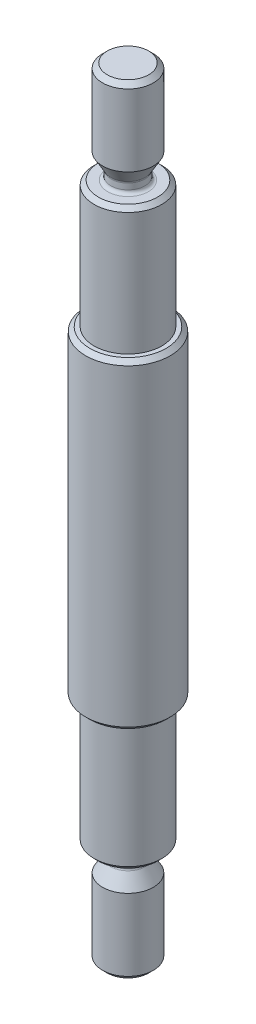
ISO-10303-21;
HEADER;
FILE_DESCRIPTION(('STEP AP214'),'2;1');
FILE_NAME('part.step','',(''),(''),'','','');
FILE_SCHEMA(('AUTOMOTIVE_DESIGN { 1 0 10303 214 1 1 1 1 }'));
ENDSEC;
DATA;
#1=APPLICATION_CONTEXT('core data for automotive mechanical design processes');
#2=APPLICATION_PROTOCOL_DEFINITION('international standard','automotive_design',2000,#1);
#3=PRODUCT_CONTEXT('',#1,'mechanical');
#4=PRODUCT('Part','Part','',(#3));
#5=PRODUCT_RELATED_PRODUCT_CATEGORY('part','',(#4));
#6=PRODUCT_DEFINITION_FORMATION('','',#4);
#7=PRODUCT_DEFINITION_CONTEXT('part definition',#1,'design');
#8=PRODUCT_DEFINITION('design','',#6,#7);
#9=PRODUCT_DEFINITION_SHAPE('','',#8);
#10=(LENGTH_UNIT() NAMED_UNIT(*) SI_UNIT(.MILLI.,.METRE.));
#11=(NAMED_UNIT(*) PLANE_ANGLE_UNIT() SI_UNIT($,.RADIAN.));
#12=(NAMED_UNIT(*) SI_UNIT($,.STERADIAN.) SOLID_ANGLE_UNIT());
#13=UNCERTAINTY_MEASURE_WITH_UNIT(LENGTH_MEASURE(1.E-05),#10,'distance_accuracy_value','');
#14=(GEOMETRIC_REPRESENTATION_CONTEXT(3) GLOBAL_UNCERTAINTY_ASSIGNED_CONTEXT((#13)) GLOBAL_UNIT_ASSIGNED_CONTEXT((#10,
#11,#12)) REPRESENTATION_CONTEXT('',''));
#15=CARTESIAN_POINT('',(0.,0.,0.));
#16=DIRECTION('',(0.,0.,1.));
#17=DIRECTION('',(1.,0.,0.));
#18=AXIS2_PLACEMENT_3D('',#15,#16,#17);
#19=CARTESIAN_POINT('',(0.,19.,0.));
#20=DIRECTION('',(0.,-1.,0.));
#21=DIRECTION('',(0.,0.,-1.));
#22=AXIS2_PLACEMENT_3D('',#19,#20,#21);
#23=CYLINDRICAL_SURFACE('',#22,5.);
#24=CARTESIAN_POINT('',(0.,18.5,0.));
#25=DIRECTION('',(0.,1.,0.));
#26=DIRECTION('',(0.,0.,1.));
#27=AXIS2_PLACEMENT_3D('',#24,#25,#26);
#28=CIRCLE('',#27,5.);
#29=CARTESIAN_POINT('',(0.,18.5,5.));
#30=VERTEX_POINT('',#29);
#31=EDGE_CURVE('E106',#30,#30,#28,.F.);
#32=ORIENTED_EDGE('',*,*,#31,.T.);
#33=EDGE_LOOP('',(#32));
#34=FACE_BOUND('',#33,.T.);
#35=CARTESIAN_POINT('',(0.,-18.5,0.));
#36=DIRECTION('',(0.,1.,0.));
#37=DIRECTION('',(0.,0.,1.));
#38=AXIS2_PLACEMENT_3D('',#35,#36,#37);
#39=CIRCLE('',#38,5.);
#40=CARTESIAN_POINT('',(0.,-18.5,5.));
#41=VERTEX_POINT('',#40);
#42=EDGE_CURVE('E110',#41,#41,#39,.T.);
#43=ORIENTED_EDGE('',*,*,#42,.T.);
#44=EDGE_LOOP('',(#43));
#45=FACE_BOUND('',#44,.T.);
#46=ADVANCED_FACE('F71',(#34,#45),#23,.T.);
#47=CARTESIAN_POINT('',(0.,19.,0.));
#48=DIRECTION('',(0.,1.,0.));
#49=DIRECTION('',(0.,0.,1.));
#50=AXIS2_PLACEMENT_3D('',#47,#48,#49);
#51=PLANE('',#50);
#52=CARTESIAN_POINT('',(0.,19.,0.));
#53=DIRECTION('',(0.,1.,0.));
#54=DIRECTION('',(0.,0.,1.));
#55=AXIS2_PLACEMENT_3D('',#52,#53,#54);
#56=CIRCLE('',#55,4.5);
#57=CARTESIAN_POINT('',(0.,19.,4.5));
#58=VERTEX_POINT('',#57);
#59=EDGE_CURVE('E114',#58,#58,#56,.T.);
#60=ORIENTED_EDGE('',*,*,#59,.T.);
#61=EDGE_LOOP('',(#60));
#62=FACE_BOUND('',#61,.T.);
#63=CARTESIAN_POINT('',(0.,19.,0.));
#64=DIRECTION('',(0.,1.,0.));
#65=DIRECTION('',(0.,0.,1.));
#66=AXIS2_PLACEMENT_3D('',#63,#64,#65);
#67=CIRCLE('',#66,4.);
#68=CARTESIAN_POINT('',(0.,19.,4.));
#69=VERTEX_POINT('',#68);
#70=EDGE_CURVE('E118',#69,#69,#67,.T.);
#71=ORIENTED_EDGE('',*,*,#70,.F.);
#72=EDGE_LOOP('',(#71));
#73=FACE_BOUND('',#72,.T.);
#74=ADVANCED_FACE('F203',(#62,#73),#51,.T.);
#75=CARTESIAN_POINT('',(0.,-19.,0.));
#76=DIRECTION('',(0.,1.,0.));
#77=DIRECTION('',(0.,0.,1.));
#78=AXIS2_PLACEMENT_3D('',#75,#76,#77);
#79=PLANE('',#78);
#80=CARTESIAN_POINT('',(0.,-19.,0.));
#81=DIRECTION('',(0.,1.,0.));
#82=DIRECTION('',(0.,0.,1.));
#83=AXIS2_PLACEMENT_3D('',#80,#81,#82);
#84=CIRCLE('',#83,4.49999999999998);
#85=CARTESIAN_POINT('',(0.,-19.,4.49999999999998));
#86=VERTEX_POINT('',#85);
#87=EDGE_CURVE('E102',#86,#86,#84,.F.);
#88=ORIENTED_EDGE('',*,*,#87,.T.);
#89=EDGE_LOOP('',(#88));
#90=FACE_BOUND('',#89,.T.);
#91=CARTESIAN_POINT('',(0.,-19.,0.));
#92=DIRECTION('',(0.,1.,0.));
#93=DIRECTION('',(0.,0.,1.));
#94=AXIS2_PLACEMENT_3D('',#91,#92,#93);
#95=CIRCLE('',#94,4.);
#96=CARTESIAN_POINT('',(0.,-19.,4.));
#97=VERTEX_POINT('',#96);
#98=EDGE_CURVE('E121',#97,#97,#95,.T.);
#99=ORIENTED_EDGE('',*,*,#98,.T.);
#100=EDGE_LOOP('',(#99));
#101=FACE_BOUND('',#100,.T.);
#102=ADVANCED_FACE('F209',(#90,#101),#79,.F.);
#103=CARTESIAN_POINT('',(0.,34.,0.));
#104=DIRECTION('',(0.,-1.,0.));
#105=DIRECTION('',(0.,0.,-1.));
#106=AXIS2_PLACEMENT_3D('',#103,#104,#105);
#107=CYLINDRICAL_SURFACE('',#106,4.);
#108=CARTESIAN_POINT('',(0.,33.5,0.));
#109=DIRECTION('',(0.,1.,0.));
#110=DIRECTION('',(0.,0.,1.));
#111=AXIS2_PLACEMENT_3D('',#108,#109,#110);
#112=CIRCLE('',#111,4.);
#113=CARTESIAN_POINT('',(0.,33.5,4.));
#114=VERTEX_POINT('',#113);
#115=EDGE_CURVE('E88',#114,#114,#112,.F.);
#116=ORIENTED_EDGE('',*,*,#115,.T.);
#117=EDGE_LOOP('',(#116));
#118=FACE_BOUND('',#117,.T.);
#119=ORIENTED_EDGE('',*,*,#70,.T.);
#120=EDGE_LOOP('',(#119));
#121=FACE_BOUND('',#120,.T.);
#122=ADVANCED_FACE('F247',(#118,#121),#107,.T.);
#123=CARTESIAN_POINT('',(0.,34.,0.));
#124=DIRECTION('',(0.,1.,0.));
#125=DIRECTION('',(0.,0.,1.));
#126=AXIS2_PLACEMENT_3D('',#123,#124,#125);
#127=PLANE('',#126);
#128=CARTESIAN_POINT('',(0.,34.,0.));
#129=DIRECTION('',(0.,1.,0.));
#130=DIRECTION('',(0.,0.,1.));
#131=AXIS2_PLACEMENT_3D('',#128,#129,#130);
#132=CIRCLE('',#131,3.49999999999999);
#133=CARTESIAN_POINT('',(0.,34.,3.49999999999999));
#134=VERTEX_POINT('',#133);
#135=EDGE_CURVE('E96',#134,#134,#132,.T.);
#136=ORIENTED_EDGE('',*,*,#135,.T.);
#137=EDGE_LOOP('',(#136));
#138=FACE_BOUND('',#137,.T.);
#139=CARTESIAN_POINT('',(0.,34.,0.));
#140=DIRECTION('',(0.,-1.,0.));
#141=DIRECTION('',(0.,0.,-1.));
#142=AXIS2_PLACEMENT_3D('',#139,#140,#141);
#143=CIRCLE('',#142,2.4);
#144=CARTESIAN_POINT('',(0.,34.,-2.4));
#145=VERTEX_POINT('',#144);
#146=EDGE_CURVE('E140',#145,#145,#143,.T.);
#147=ORIENTED_EDGE('',*,*,#146,.T.);
#148=EDGE_LOOP('',(#147));
#149=FACE_BOUND('',#148,.T.);
#150=ADVANCED_FACE('F252',(#138,#149),#127,.T.);
#151=CARTESIAN_POINT('',(0.,-34.,0.));
#152=DIRECTION('',(0.,1.,0.));
#153=DIRECTION('',(0.,0.,1.));
#154=AXIS2_PLACEMENT_3D('',#151,#152,#153);
#155=CYLINDRICAL_SURFACE('',#154,4.);
#156=CARTESIAN_POINT('',(0.,-33.5,0.));
#157=DIRECTION('',(0.,1.,0.));
#158=DIRECTION('',(0.,0.,1.));
#159=AXIS2_PLACEMENT_3D('',#156,#157,#158);
#160=CIRCLE('',#159,4.);
#161=CARTESIAN_POINT('',(0.,-33.5,4.));
#162=VERTEX_POINT('',#161);
#163=EDGE_CURVE('E80',#162,#162,#160,.T.);
#164=ORIENTED_EDGE('',*,*,#163,.T.);
#165=EDGE_LOOP('',(#164));
#166=FACE_BOUND('',#165,.T.);
#167=ORIENTED_EDGE('',*,*,#98,.F.);
#168=EDGE_LOOP('',(#167));
#169=FACE_BOUND('',#168,.T.);
#170=ADVANCED_FACE('F250',(#166,#169),#155,.T.);
#171=CARTESIAN_POINT('',(0.,-34.,0.));
#172=DIRECTION('',(0.,1.,0.));
#173=DIRECTION('',(0.,0.,1.));
#174=AXIS2_PLACEMENT_3D('',#171,#172,#173);
#175=PLANE('',#174);
#176=CARTESIAN_POINT('',(0.,-34.,0.));
#177=DIRECTION('',(0.,1.,0.));
#178=DIRECTION('',(0.,0.,1.));
#179=AXIS2_PLACEMENT_3D('',#176,#177,#178);
#180=CIRCLE('',#179,3.5);
#181=CARTESIAN_POINT('',(0.,-34.,3.5));
#182=VERTEX_POINT('',#181);
#183=EDGE_CURVE('E11',#182,#182,#180,.F.);
#184=ORIENTED_EDGE('',*,*,#183,.T.);
#185=EDGE_LOOP('',(#184));
#186=FACE_BOUND('',#185,.T.);
#187=CARTESIAN_POINT('',(0.,-34.,0.));
#188=DIRECTION('',(0.,1.,0.));
#189=DIRECTION('',(0.,0.,1.));
#190=AXIS2_PLACEMENT_3D('',#187,#188,#189);
#191=CIRCLE('',#190,2.4);
#192=CARTESIAN_POINT('',(0.,-34.,2.4));
#193=VERTEX_POINT('',#192);
#194=EDGE_CURVE('E168',#193,#193,#191,.T.);
#195=ORIENTED_EDGE('',*,*,#194,.T.);
#196=EDGE_LOOP('',(#195));
#197=FACE_BOUND('',#196,.T.);
#198=ADVANCED_FACE('F223',(#186,#197),#175,.F.);
#199=CARTESIAN_POINT('',(0.,19.,0.));
#200=DIRECTION('',(0.,-1.,0.));
#201=DIRECTION('',(0.,0.,-1.));
#202=AXIS2_PLACEMENT_3D('',#199,#200,#201);
#203=CONICAL_SURFACE('',#202,4.5,0.785398163397444);
#204=ORIENTED_EDGE('',*,*,#31,.F.);
#205=EDGE_LOOP('',(#204));
#206=FACE_BOUND('',#205,.T.);
#207=ORIENTED_EDGE('',*,*,#59,.F.);
#208=EDGE_LOOP('',(#207));
#209=FACE_BOUND('',#208,.T.);
#210=ADVANCED_FACE('F216',(#206,#209),#203,.T.);
#211=CARTESIAN_POINT('',(0.,-18.5,0.));
#212=DIRECTION('',(0.,1.,0.));
#213=DIRECTION('',(0.,0.,1.));
#214=AXIS2_PLACEMENT_3D('',#211,#212,#213);
#215=CONICAL_SURFACE('',#214,5.,0.785398163397458);
#216=ORIENTED_EDGE('',*,*,#87,.F.);
#217=EDGE_LOOP('',(#216));
#218=FACE_BOUND('',#217,.T.);
#219=ORIENTED_EDGE('',*,*,#42,.F.);
#220=EDGE_LOOP('',(#219));
#221=FACE_BOUND('',#220,.T.);
#222=ADVANCED_FACE('F222',(#218,#221),#215,.T.);
#223=CARTESIAN_POINT('',(0.,46.,0.));
#224=DIRECTION('',(0.,-1.,0.));
#225=DIRECTION('',(0.,0.,-1.));
#226=AXIS2_PLACEMENT_3D('',#223,#224,#225);
#227=CYLINDRICAL_SURFACE('',#226,3.);
#228=CARTESIAN_POINT('',(0.,36.9392304845413,0.));
#229=DIRECTION('',(0.,-1.,0.));
#230=DIRECTION('',(0.,0.,-1.));
#231=AXIS2_PLACEMENT_3D('',#228,#229,#230);
#232=CIRCLE('',#231,3.);
#233=CARTESIAN_POINT('',(0.,36.9392304845413,-3.));
#234=VERTEX_POINT('',#233);
#235=EDGE_CURVE('E124',#234,#234,#232,.T.);
#236=ORIENTED_EDGE('',*,*,#235,.F.);
#237=EDGE_LOOP('',(#236));
#238=FACE_BOUND('',#237,.T.);
#239=CARTESIAN_POINT('',(0.,45.4455,0.));
#240=DIRECTION('',(0.,-1.,0.));
#241=DIRECTION('',(0.,0.,-1.));
#242=AXIS2_PLACEMENT_3D('',#239,#240,#241);
#243=CIRCLE('',#242,3.);
#244=CARTESIAN_POINT('',(0.,45.4455,-3.));
#245=VERTEX_POINT('',#244);
#246=EDGE_CURVE('E148',#245,#245,#243,.T.);
#247=ORIENTED_EDGE('',*,*,#246,.T.);
#248=EDGE_LOOP('',(#247));
#249=FACE_BOUND('',#248,.T.);
#250=ADVANCED_FACE('F229',(#238,#249),#227,.T.);
#251=CARTESIAN_POINT('',(0.,36.9392304845413,0.));
#252=DIRECTION('',(0.,1.,0.));
#253=DIRECTION('',(0.,0.,1.));
#254=AXIS2_PLACEMENT_3D('',#251,#252,#253);
#255=CONICAL_SURFACE('',#254,3.,0.523598775598297);
#256=CARTESIAN_POINT('',(0.,35.3,0.));
#257=DIRECTION('',(0.,-1.,0.));
#258=DIRECTION('',(0.,0.,-1.));
#259=AXIS2_PLACEMENT_3D('',#256,#257,#258);
#260=CIRCLE('',#259,2.05358983848622);
#261=CARTESIAN_POINT('',(0.,35.3,-2.05358983848622));
#262=VERTEX_POINT('',#261);
#263=EDGE_CURVE('E128',#262,#262,#260,.T.);
#264=ORIENTED_EDGE('',*,*,#263,.F.);
#265=EDGE_LOOP('',(#264));
#266=FACE_BOUND('',#265,.T.);
#267=ORIENTED_EDGE('',*,*,#235,.T.);
#268=EDGE_LOOP('',(#267));
#269=FACE_BOUND('',#268,.T.);
#270=ADVANCED_FACE('F238',(#266,#269),#255,.T.);
#271=CARTESIAN_POINT('',(0.,35.1,0.));
#272=DIRECTION('',(0.,-1.,0.));
#273=DIRECTION('',(0.,0.,-1.));
#274=AXIS2_PLACEMENT_3D('',#271,#272,#273);
#275=TOROIDAL_SURFACE('',#274,2.4,0.400000000000001);
#276=CARTESIAN_POINT('',(0.,35.1,0.));
#277=DIRECTION('',(0.,-1.,0.));
#278=DIRECTION('',(0.,0.,-1.));
#279=AXIS2_PLACEMENT_3D('',#276,#277,#278);
#280=CIRCLE('',#279,2.);
#281=CARTESIAN_POINT('',(0.,35.1,-2.));
#282=VERTEX_POINT('',#281);
#283=EDGE_CURVE('E132',#282,#282,#280,.T.);
#284=ORIENTED_EDGE('',*,*,#283,.F.);
#285=EDGE_LOOP('',(#284));
#286=FACE_BOUND('',#285,.T.);
#287=ORIENTED_EDGE('',*,*,#263,.T.);
#288=EDGE_LOOP('',(#287));
#289=FACE_BOUND('',#288,.T.);
#290=ADVANCED_FACE('F286',(#286,#289),#275,.F.);
#291=CARTESIAN_POINT('',(0.,46.,0.));
#292=DIRECTION('',(0.,-1.,0.));
#293=DIRECTION('',(0.,0.,-1.));
#294=AXIS2_PLACEMENT_3D('',#291,#292,#293);
#295=CYLINDRICAL_SURFACE('',#294,2.);
#296=CARTESIAN_POINT('',(0.,34.4,0.));
#297=DIRECTION('',(0.,-1.,0.));
#298=DIRECTION('',(0.,0.,-1.));
#299=AXIS2_PLACEMENT_3D('',#296,#297,#298);
#300=CIRCLE('',#299,2.);
#301=CARTESIAN_POINT('',(0.,34.4,-2.));
#302=VERTEX_POINT('',#301);
#303=EDGE_CURVE('E136',#302,#302,#300,.T.);
#304=ORIENTED_EDGE('',*,*,#303,.F.);
#305=EDGE_LOOP('',(#304));
#306=FACE_BOUND('',#305,.T.);
#307=ORIENTED_EDGE('',*,*,#283,.T.);
#308=EDGE_LOOP('',(#307));
#309=FACE_BOUND('',#308,.T.);
#310=ADVANCED_FACE('F280',(#306,#309),#295,.T.);
#311=CARTESIAN_POINT('',(0.,34.4,0.));
#312=DIRECTION('',(0.,-1.,0.));
#313=DIRECTION('',(0.,0.,-1.));
#314=AXIS2_PLACEMENT_3D('',#311,#312,#313);
#315=TOROIDAL_SURFACE('',#314,2.4,0.4);
#316=ORIENTED_EDGE('',*,*,#146,.F.);
#317=EDGE_LOOP('',(#316));
#318=FACE_BOUND('',#317,.T.);
#319=ORIENTED_EDGE('',*,*,#303,.T.);
#320=EDGE_LOOP('',(#319));
#321=FACE_BOUND('',#320,.T.);
#322=ADVANCED_FACE('F276',(#318,#321),#315,.F.);
#323=CARTESIAN_POINT('',(0.,46.,0.));
#324=DIRECTION('',(0.,-1.,0.));
#325=DIRECTION('',(0.,0.,-1.));
#326=AXIS2_PLACEMENT_3D('',#323,#324,#325);
#327=CONICAL_SURFACE('',#326,2.4455,0.785398163397449);
#328=ORIENTED_EDGE('',*,*,#246,.F.);
#329=EDGE_LOOP('',(#328));
#330=FACE_BOUND('',#329,.T.);
#331=CARTESIAN_POINT('',(0.,46.,0.));
#332=DIRECTION('',(0.,-1.,0.));
#333=DIRECTION('',(0.,0.,-1.));
#334=AXIS2_PLACEMENT_3D('',#331,#332,#333);
#335=CIRCLE('',#334,2.4455);
#336=CARTESIAN_POINT('',(0.,46.,-2.4455));
#337=VERTEX_POINT('',#336);
#338=EDGE_CURVE('E144',#337,#337,#335,.T.);
#339=ORIENTED_EDGE('',*,*,#338,.T.);
#340=EDGE_LOOP('',(#339));
#341=FACE_BOUND('',#340,.T.);
#342=ADVANCED_FACE('F279',(#330,#341),#327,.T.);
#343=CARTESIAN_POINT('',(0.,46.,0.));
#344=DIRECTION('',(0.,1.,0.));
#345=DIRECTION('',(0.,0.,1.));
#346=AXIS2_PLACEMENT_3D('',#343,#344,#345);
#347=PLANE('',#346);
#348=ORIENTED_EDGE('',*,*,#338,.F.);
#349=EDGE_LOOP('',(#348));
#350=FACE_BOUND('',#349,.T.);
#351=ADVANCED_FACE('F304',(#350),#347,.T.);
#352=CARTESIAN_POINT('',(0.,-46.,0.));
#353=DIRECTION('',(0.,1.,0.));
#354=DIRECTION('',(0.,0.,1.));
#355=AXIS2_PLACEMENT_3D('',#352,#353,#354);
#356=CYLINDRICAL_SURFACE('',#355,3.);
#357=CARTESIAN_POINT('',(0.,-36.9392304845413,0.));
#358=DIRECTION('',(0.,1.,0.));
#359=DIRECTION('',(0.,0.,1.));
#360=AXIS2_PLACEMENT_3D('',#357,#358,#359);
#361=CIRCLE('',#360,3.);
#362=CARTESIAN_POINT('',(0.,-36.9392304845413,3.));
#363=VERTEX_POINT('',#362);
#364=EDGE_CURVE('E152',#363,#363,#361,.T.);
#365=ORIENTED_EDGE('',*,*,#364,.F.);
#366=EDGE_LOOP('',(#365));
#367=FACE_BOUND('',#366,.T.);
#368=CARTESIAN_POINT('',(0.,-45.4455,0.));
#369=DIRECTION('',(0.,1.,0.));
#370=DIRECTION('',(0.,0.,1.));
#371=AXIS2_PLACEMENT_3D('',#368,#369,#370);
#372=CIRCLE('',#371,3.);
#373=CARTESIAN_POINT('',(0.,-45.4455,3.));
#374=VERTEX_POINT('',#373);
#375=EDGE_CURVE('E176',#374,#374,#372,.T.);
#376=ORIENTED_EDGE('',*,*,#375,.T.);
#377=EDGE_LOOP('',(#376));
#378=FACE_BOUND('',#377,.T.);
#379=ADVANCED_FACE('F183',(#367,#378),#356,.T.);
#380=CARTESIAN_POINT('',(0.,-36.9392304845413,0.));
#381=DIRECTION('',(0.,-1.,0.));
#382=DIRECTION('',(0.,0.,-1.));
#383=AXIS2_PLACEMENT_3D('',#380,#381,#382);
#384=CONICAL_SURFACE('',#383,3.,0.523598775598297);
#385=CARTESIAN_POINT('',(0.,-35.3,0.));
#386=DIRECTION('',(0.,1.,0.));
#387=DIRECTION('',(0.,0.,1.));
#388=AXIS2_PLACEMENT_3D('',#385,#386,#387);
#389=CIRCLE('',#388,2.05358983848622);
#390=CARTESIAN_POINT('',(0.,-35.3,2.05358983848622));
#391=VERTEX_POINT('',#390);
#392=EDGE_CURVE('E156',#391,#391,#389,.T.);
#393=ORIENTED_EDGE('',*,*,#392,.F.);
#394=EDGE_LOOP('',(#393));
#395=FACE_BOUND('',#394,.T.);
#396=ORIENTED_EDGE('',*,*,#364,.T.);
#397=EDGE_LOOP('',(#396));
#398=FACE_BOUND('',#397,.T.);
#399=ADVANCED_FACE('F311',(#395,#398),#384,.T.);
#400=CARTESIAN_POINT('',(0.,-35.1,0.));
#401=DIRECTION('',(0.,1.,0.));
#402=DIRECTION('',(0.,0.,1.));
#403=AXIS2_PLACEMENT_3D('',#400,#401,#402);
#404=TOROIDAL_SURFACE('',#403,2.4,0.400000000000001);
#405=CARTESIAN_POINT('',(0.,-35.1,0.));
#406=DIRECTION('',(0.,1.,0.));
#407=DIRECTION('',(0.,0.,1.));
#408=AXIS2_PLACEMENT_3D('',#405,#406,#407);
#409=CIRCLE('',#408,2.);
#410=CARTESIAN_POINT('',(0.,-35.1,2.));
#411=VERTEX_POINT('',#410);
#412=EDGE_CURVE('E160',#411,#411,#409,.T.);
#413=ORIENTED_EDGE('',*,*,#412,.F.);
#414=EDGE_LOOP('',(#413));
#415=FACE_BOUND('',#414,.T.);
#416=ORIENTED_EDGE('',*,*,#392,.T.);
#417=EDGE_LOOP('',(#416));
#418=FACE_BOUND('',#417,.T.);
#419=ADVANCED_FACE('F316',(#415,#418),#404,.F.);
#420=CARTESIAN_POINT('',(0.,-46.,0.));
#421=DIRECTION('',(0.,1.,0.));
#422=DIRECTION('',(0.,0.,1.));
#423=AXIS2_PLACEMENT_3D('',#420,#421,#422);
#424=CYLINDRICAL_SURFACE('',#423,2.);
#425=CARTESIAN_POINT('',(0.,-34.4,0.));
#426=DIRECTION('',(0.,1.,0.));
#427=DIRECTION('',(0.,0.,1.));
#428=AXIS2_PLACEMENT_3D('',#425,#426,#427);
#429=CIRCLE('',#428,2.);
#430=CARTESIAN_POINT('',(0.,-34.4,2.));
#431=VERTEX_POINT('',#430);
#432=EDGE_CURVE('E164',#431,#431,#429,.T.);
#433=ORIENTED_EDGE('',*,*,#432,.F.);
#434=EDGE_LOOP('',(#433));
#435=FACE_BOUND('',#434,.T.);
#436=ORIENTED_EDGE('',*,*,#412,.T.);
#437=EDGE_LOOP('',(#436));
#438=FACE_BOUND('',#437,.T.);
#439=ADVANCED_FACE('F323',(#435,#438),#424,.T.);
#440=CARTESIAN_POINT('',(0.,-34.4,0.));
#441=DIRECTION('',(0.,1.,0.));
#442=DIRECTION('',(0.,0.,1.));
#443=AXIS2_PLACEMENT_3D('',#440,#441,#442);
#444=TOROIDAL_SURFACE('',#443,2.4,0.4);
#445=ORIENTED_EDGE('',*,*,#194,.F.);
#446=EDGE_LOOP('',(#445));
#447=FACE_BOUND('',#446,.T.);
#448=ORIENTED_EDGE('',*,*,#432,.T.);
#449=EDGE_LOOP('',(#448));
#450=FACE_BOUND('',#449,.T.);
#451=ADVANCED_FACE('F189',(#447,#450),#444,.F.);
#452=CARTESIAN_POINT('',(0.,-46.,0.));
#453=DIRECTION('',(0.,1.,0.));
#454=DIRECTION('',(0.,0.,1.));
#455=AXIS2_PLACEMENT_3D('',#452,#453,#454);
#456=CONICAL_SURFACE('',#455,2.4455,0.785398163397449);
#457=ORIENTED_EDGE('',*,*,#375,.F.);
#458=EDGE_LOOP('',(#457));
#459=FACE_BOUND('',#458,.T.);
#460=CARTESIAN_POINT('',(0.,-46.,0.));
#461=DIRECTION('',(0.,1.,0.));
#462=DIRECTION('',(0.,0.,1.));
#463=AXIS2_PLACEMENT_3D('',#460,#461,#462);
#464=CIRCLE('',#463,2.4455);
#465=CARTESIAN_POINT('',(0.,-46.,2.4455));
#466=VERTEX_POINT('',#465);
#467=EDGE_CURVE('E172',#466,#466,#464,.T.);
#468=ORIENTED_EDGE('',*,*,#467,.T.);
#469=EDGE_LOOP('',(#468));
#470=FACE_BOUND('',#469,.T.);
#471=ADVANCED_FACE('F185',(#459,#470),#456,.T.);
#472=CARTESIAN_POINT('',(0.,-46.,0.));
#473=DIRECTION('',(0.,-1.,0.));
#474=DIRECTION('',(0.,0.,1.));
#475=AXIS2_PLACEMENT_3D('',#472,#473,#474);
#476=PLANE('',#475);
#477=ORIENTED_EDGE('',*,*,#467,.F.);
#478=EDGE_LOOP('',(#477));
#479=FACE_BOUND('',#478,.T.);
#480=ADVANCED_FACE('F188',(#479),#476,.T.);
#481=CARTESIAN_POINT('',(0.,34.,0.));
#482=DIRECTION('',(0.,-1.,0.));
#483=DIRECTION('',(0.,0.,-1.));
#484=AXIS2_PLACEMENT_3D('',#481,#482,#483);
#485=CONICAL_SURFACE('',#484,3.49999999999999,0.785398163397445);
#486=ORIENTED_EDGE('',*,*,#115,.F.);
#487=EDGE_LOOP('',(#486));
#488=FACE_BOUND('',#487,.T.);
#489=ORIENTED_EDGE('',*,*,#135,.F.);
#490=EDGE_LOOP('',(#489));
#491=FACE_BOUND('',#490,.T.);
#492=ADVANCED_FACE('F194',(#488,#491),#485,.T.);
#493=CARTESIAN_POINT('',(0.,-33.5,0.));
#494=DIRECTION('',(0.,1.,0.));
#495=DIRECTION('',(0.,0.,1.));
#496=AXIS2_PLACEMENT_3D('',#493,#494,#495);
#497=CONICAL_SURFACE('',#496,4.,0.785398163397459);
#498=ORIENTED_EDGE('',*,*,#183,.F.);
#499=EDGE_LOOP('',(#498));
#500=FACE_BOUND('',#499,.T.);
#501=ORIENTED_EDGE('',*,*,#163,.F.);
#502=EDGE_LOOP('',(#501));
#503=FACE_BOUND('',#502,.T.);
#504=ADVANCED_FACE('F74',(#500,#503),#497,.T.);
#505=CLOSED_SHELL('',(#46,#74,#102,#122,#150,#170,#198,#210,#222,#250,#270,#290,#310,#322,#342,
#351,#379,#399,#419,#439,#451,#471,#480,#492,#504));
#506=MANIFOLD_SOLID_BREP('B2',#505);
#507=ADVANCED_BREP_SHAPE_REPRESENTATION('',(#18,#506),#14);
#508=SHAPE_DEFINITION_REPRESENTATION(#9,#507);
ENDSEC;
END-ISO-10303-21;
